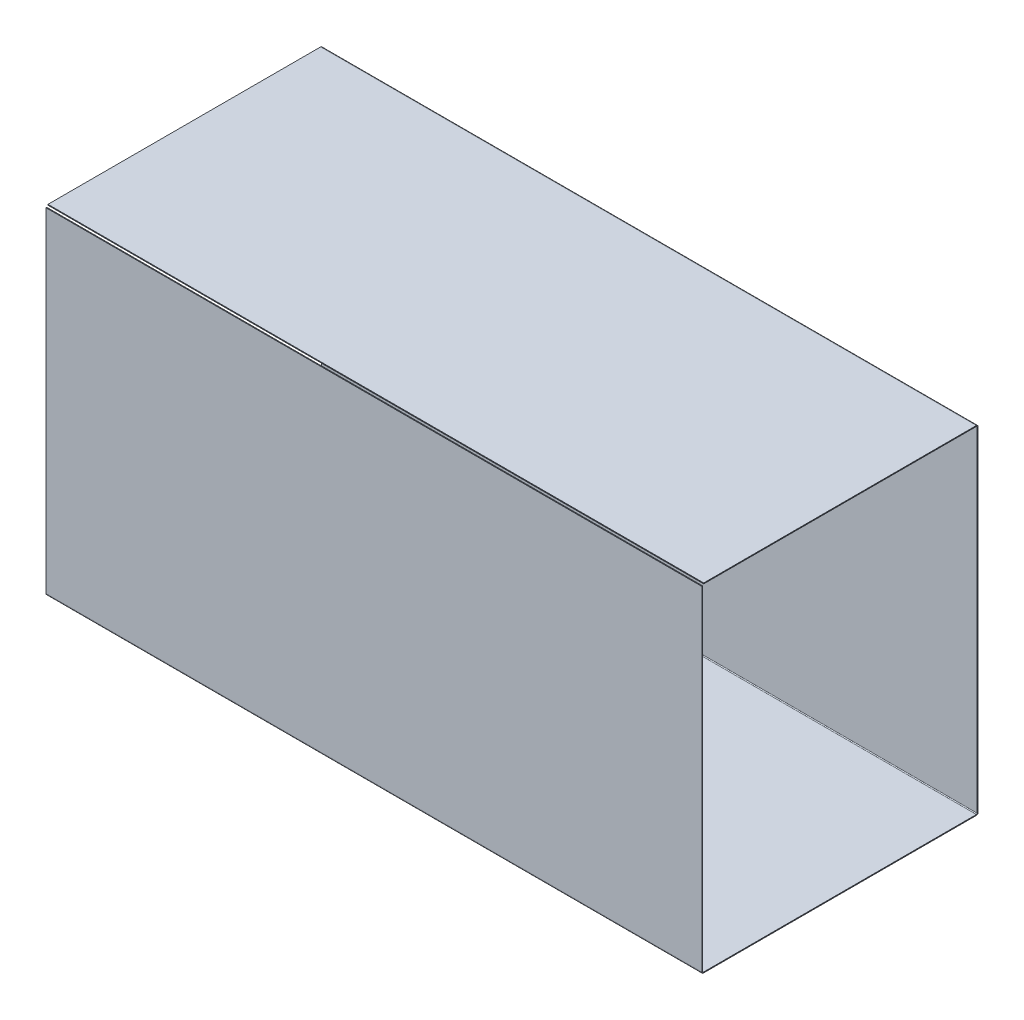
ISO-10303-21;
HEADER;
FILE_DESCRIPTION(('STEP AP214'),'2;1');
FILE_NAME('part.step','',(''),(''),'','','');
FILE_SCHEMA(('AUTOMOTIVE_DESIGN { 1 0 10303 214 1 1 1 1 }'));
ENDSEC;
DATA;
#1=APPLICATION_CONTEXT('core data for automotive mechanical design processes');
#2=APPLICATION_PROTOCOL_DEFINITION('international standard','automotive_design',2000,#1);
#3=PRODUCT_CONTEXT('',#1,'mechanical');
#4=PRODUCT('Part','Part','',(#3));
#5=PRODUCT_RELATED_PRODUCT_CATEGORY('part','',(#4));
#6=PRODUCT_DEFINITION_FORMATION('','',#4);
#7=PRODUCT_DEFINITION_CONTEXT('part definition',#1,'design');
#8=PRODUCT_DEFINITION('design','',#6,#7);
#9=PRODUCT_DEFINITION_SHAPE('','',#8);
#10=(LENGTH_UNIT() NAMED_UNIT(*) SI_UNIT(.MILLI.,.METRE.));
#11=(NAMED_UNIT(*) PLANE_ANGLE_UNIT() SI_UNIT($,.RADIAN.));
#12=(NAMED_UNIT(*) SI_UNIT($,.STERADIAN.) SOLID_ANGLE_UNIT());
#13=UNCERTAINTY_MEASURE_WITH_UNIT(LENGTH_MEASURE(1.E-05),#10,'distance_accuracy_value','');
#14=(GEOMETRIC_REPRESENTATION_CONTEXT(3) GLOBAL_UNCERTAINTY_ASSIGNED_CONTEXT((#13)) GLOBAL_UNIT_ASSIGNED_CONTEXT((#10,
#11,#12)) REPRESENTATION_CONTEXT('',''));
#15=CARTESIAN_POINT('',(0.,0.,0.));
#16=DIRECTION('',(0.,0.,1.));
#17=DIRECTION('',(1.,0.,0.));
#18=AXIS2_PLACEMENT_3D('',#15,#16,#17);
#19=CARTESIAN_POINT('',(800.,-125.,-167.5));
#20=DIRECTION('',(1.,0.,0.));
#21=DIRECTION('',(0.,1.,0.));
#22=AXIS2_PLACEMENT_3D('',#19,#20,#21);
#23=PLANE('',#22);
#24=DIRECTION('',(0.,0.,-1.));
#25=VECTOR('',#24,1.);
#26=CARTESIAN_POINT('',(800.,284.,-167.5));
#27=LINE('',#26,#25);
#28=CARTESIAN_POINT('',(800.,284.,-167.5));
#29=VERTEX_POINT('',#28);
#30=CARTESIAN_POINT('',(800.,284.,-168.5));
#31=VERTEX_POINT('',#30);
#32=EDGE_CURVE('E11',#29,#31,#27,.T.);
#33=ORIENTED_EDGE('',*,*,#32,.F.);
#34=DIRECTION('',(0.,1.,0.));
#35=VECTOR('',#34,1.);
#36=CARTESIAN_POINT('',(800.,-125.,-167.5));
#37=LINE('',#36,#35);
#38=CARTESIAN_POINT('',(800.,-124.,-167.5));
#39=VERTEX_POINT('',#38);
#40=EDGE_CURVE('E241',#39,#29,#37,.T.);
#41=ORIENTED_EDGE('',*,*,#40,.F.);
#42=DIRECTION('',(0.,0.,-1.));
#43=VECTOR('',#42,1.);
#44=CARTESIAN_POINT('',(800.,-124.,-167.5));
#45=LINE('',#44,#43);
#46=CARTESIAN_POINT('',(800.,-124.,-168.5));
#47=VERTEX_POINT('',#46);
#48=EDGE_CURVE('E47',#39,#47,#45,.T.);
#49=ORIENTED_EDGE('',*,*,#48,.T.);
#50=DIRECTION('',(0.,1.,0.));
#51=VECTOR('',#50,1.);
#52=CARTESIAN_POINT('',(800.,0.,-168.5));
#53=LINE('',#52,#51);
#54=EDGE_CURVE('E173',#47,#31,#53,.T.);
#55=ORIENTED_EDGE('',*,*,#54,.T.);
#56=EDGE_LOOP('',(#33,#41,#49,#55));
#57=FACE_BOUND('',#56,.T.);
#58=ADVANCED_FACE('F37',(#57),#23,.T.);
#59=CARTESIAN_POINT('',(800.,-124.,-166.5));
#60=DIRECTION('',(-1.,0.,0.));
#61=DIRECTION('',(0.,0.,1.));
#62=AXIS2_PLACEMENT_3D('',#59,#60,#61);
#63=PLANE('',#62);
#64=ORIENTED_EDGE('',*,*,#48,.F.);
#65=CARTESIAN_POINT('',(800.,-124.,-166.5));
#66=DIRECTION('',(1.,0.,0.));
#67=DIRECTION('',(0.,0.,-1.));
#68=AXIS2_PLACEMENT_3D('',#65,#66,#67);
#69=CIRCLE('',#68,1.);
#70=CARTESIAN_POINT('',(800.,-125.,-166.5));
#71=VERTEX_POINT('',#70);
#72=EDGE_CURVE('E286',#39,#71,#69,.F.);
#73=ORIENTED_EDGE('',*,*,#72,.T.);
#74=DIRECTION('',(0.,-1.,0.));
#75=VECTOR('',#74,1.);
#76=CARTESIAN_POINT('',(800.,-125.,-166.5));
#77=LINE('',#76,#75);
#78=CARTESIAN_POINT('',(800.,-126.,-166.5));
#79=VERTEX_POINT('',#78);
#80=EDGE_CURVE('E313',#71,#79,#77,.T.);
#81=ORIENTED_EDGE('',*,*,#80,.T.);
#82=CARTESIAN_POINT('',(800.,-124.,-166.5));
#83=DIRECTION('',(1.,0.,0.));
#84=DIRECTION('',(0.,1.,0.));
#85=AXIS2_PLACEMENT_3D('',#82,#83,#84);
#86=CIRCLE('',#85,2.);
#87=EDGE_CURVE('E217',#47,#79,#86,.F.);
#88=ORIENTED_EDGE('',*,*,#87,.F.);
#89=EDGE_LOOP('',(#64,#73,#81,#88));
#90=FACE_BOUND('',#89,.T.);
#91=ADVANCED_FACE('F316',(#90),#63,.F.);
#92=CARTESIAN_POINT('',(800.,-125.,167.5));
#93=DIRECTION('',(1.,0.,0.));
#94=DIRECTION('',(0.,0.,-1.));
#95=AXIS2_PLACEMENT_3D('',#92,#93,#94);
#96=PLANE('',#95);
#97=ORIENTED_EDGE('',*,*,#80,.F.);
#98=DIRECTION('',(0.,0.,-1.));
#99=VECTOR('',#98,1.);
#100=CARTESIAN_POINT('',(800.,-125.,167.5));
#101=LINE('',#100,#99);
#102=CARTESIAN_POINT('',(800.,-125.,166.5));
#103=VERTEX_POINT('',#102);
#104=EDGE_CURVE('E231',#103,#71,#101,.T.);
#105=ORIENTED_EDGE('',*,*,#104,.F.);
#106=DIRECTION('',(0.,-1.,0.));
#107=VECTOR('',#106,1.);
#108=CARTESIAN_POINT('',(800.,-125.,166.5));
#109=LINE('',#108,#107);
#110=CARTESIAN_POINT('',(800.,-126.,166.5));
#111=VERTEX_POINT('',#110);
#112=EDGE_CURVE('E146',#103,#111,#109,.T.);
#113=ORIENTED_EDGE('',*,*,#112,.T.);
#114=DIRECTION('',(0.,0.,1.));
#115=VECTOR('',#114,1.);
#116=CARTESIAN_POINT('',(800.,-126.,167.5));
#117=LINE('',#116,#115);
#118=EDGE_CURVE('E219',#111,#79,#117,.F.);
#119=ORIENTED_EDGE('',*,*,#118,.T.);
#120=EDGE_LOOP('',(#97,#105,#113,#119));
#121=FACE_BOUND('',#120,.T.);
#122=ADVANCED_FACE('F325',(#121),#96,.T.);
#123=CARTESIAN_POINT('',(800.,-124.,166.5));
#124=DIRECTION('',(1.,0.,0.));
#125=DIRECTION('',(0.,0.,-1.));
#126=AXIS2_PLACEMENT_3D('',#123,#124,#125);
#127=PLANE('',#126);
#128=ORIENTED_EDGE('',*,*,#112,.F.);
#129=CARTESIAN_POINT('',(800.,-124.,166.5));
#130=DIRECTION('',(-1.,0.,0.));
#131=DIRECTION('',(0.,0.,1.));
#132=AXIS2_PLACEMENT_3D('',#129,#130,#131);
#133=CIRCLE('',#132,1.);
#134=CARTESIAN_POINT('',(800.,-124.,167.5));
#135=VERTEX_POINT('',#134);
#136=EDGE_CURVE('E278',#103,#135,#133,.T.);
#137=ORIENTED_EDGE('',*,*,#136,.T.);
#138=DIRECTION('',(0.,0.,1.));
#139=VECTOR('',#138,1.);
#140=CARTESIAN_POINT('',(800.,-124.,167.5));
#141=LINE('',#140,#139);
#142=CARTESIAN_POINT('',(800.,-124.,168.5));
#143=VERTEX_POINT('',#142);
#144=EDGE_CURVE('E310',#135,#143,#141,.T.);
#145=ORIENTED_EDGE('',*,*,#144,.T.);
#146=CARTESIAN_POINT('',(800.,-124.,166.5));
#147=DIRECTION('',(-1.,0.,0.));
#148=DIRECTION('',(0.,-1.,0.));
#149=AXIS2_PLACEMENT_3D('',#146,#147,#148);
#150=CIRCLE('',#149,2.);
#151=EDGE_CURVE('E182',#111,#143,#150,.T.);
#152=ORIENTED_EDGE('',*,*,#151,.F.);
#153=EDGE_LOOP('',(#128,#137,#145,#152));
#154=FACE_BOUND('',#153,.T.);
#155=ADVANCED_FACE('F402',(#154),#127,.T.);
#156=CARTESIAN_POINT('',(800.,-125.,167.5));
#157=DIRECTION('',(1.,0.,0.));
#158=DIRECTION('',(0.,1.,0.));
#159=AXIS2_PLACEMENT_3D('',#156,#157,#158);
#160=PLANE('',#159);
#161=ORIENTED_EDGE('',*,*,#144,.F.);
#162=DIRECTION('',(0.,1.,0.));
#163=VECTOR('',#162,1.);
#164=CARTESIAN_POINT('',(800.,-125.,167.5));
#165=LINE('',#164,#163);
#166=CARTESIAN_POINT('',(800.,283.585786437627,167.5));
#167=VERTEX_POINT('',#166);
#168=EDGE_CURVE('E245',#135,#167,#165,.T.);
#169=ORIENTED_EDGE('',*,*,#168,.T.);
#170=DIRECTION('',(0.,0.,1.));
#171=VECTOR('',#170,1.);
#172=CARTESIAN_POINT('',(800.,283.585786437627,167.5));
#173=LINE('',#172,#171);
#174=CARTESIAN_POINT('',(800.,283.585786437627,168.5));
#175=VERTEX_POINT('',#174);
#176=EDGE_CURVE('E308',#167,#175,#173,.T.);
#177=ORIENTED_EDGE('',*,*,#176,.T.);
#178=DIRECTION('',(0.,1.,0.));
#179=VECTOR('',#178,1.);
#180=CARTESIAN_POINT('',(800.,0.,168.5));
#181=LINE('',#180,#179);
#182=EDGE_CURVE('E172',#143,#175,#181,.T.);
#183=ORIENTED_EDGE('',*,*,#182,.F.);
#184=EDGE_LOOP('',(#161,#169,#177,#183));
#185=FACE_BOUND('',#184,.T.);
#186=ADVANCED_FACE('F405',(#185),#160,.T.);
#187=CARTESIAN_POINT('',(0.,283.585786437627,167.5));
#188=DIRECTION('',(0.,1.,0.));
#189=DIRECTION('',(-1.,0.,0.));
#190=AXIS2_PLACEMENT_3D('',#187,#188,#189);
#191=PLANE('',#190);
#192=ORIENTED_EDGE('',*,*,#176,.F.);
#193=DIRECTION('',(-1.,0.,0.));
#194=VECTOR('',#193,1.);
#195=CARTESIAN_POINT('',(0.,283.585786437627,167.5));
#196=LINE('',#195,#194);
#197=CARTESIAN_POINT('',(0.,283.585786437627,167.5));
#198=VERTEX_POINT('',#197);
#199=EDGE_CURVE('E254',#167,#198,#196,.T.);
#200=ORIENTED_EDGE('',*,*,#199,.T.);
#201=DIRECTION('',(0.,0.,1.));
#202=VECTOR('',#201,1.);
#203=CARTESIAN_POINT('',(0.,283.585786437627,167.5));
#204=LINE('',#203,#202);
#205=CARTESIAN_POINT('',(0.,283.585786437627,168.5));
#206=VERTEX_POINT('',#205);
#207=EDGE_CURVE('E130',#198,#206,#204,.T.);
#208=ORIENTED_EDGE('',*,*,#207,.T.);
#209=DIRECTION('',(1.,0.,0.));
#210=VECTOR('',#209,1.);
#211=CARTESIAN_POINT('',(0.,283.585786437627,168.5));
#212=LINE('',#211,#210);
#213=EDGE_CURVE('E171',#175,#206,#212,.F.);
#214=ORIENTED_EDGE('',*,*,#213,.F.);
#215=EDGE_LOOP('',(#192,#200,#208,#214));
#216=FACE_BOUND('',#215,.T.);
#217=ADVANCED_FACE('F409',(#216),#191,.T.);
#218=CARTESIAN_POINT('',(0.,285.,167.5));
#219=DIRECTION('',(-1.,0.,0.));
#220=DIRECTION('',(0.,-1.,0.));
#221=AXIS2_PLACEMENT_3D('',#218,#219,#220);
#222=PLANE('',#221);
#223=ORIENTED_EDGE('',*,*,#207,.F.);
#224=DIRECTION('',(0.,-1.,0.));
#225=VECTOR('',#224,1.);
#226=CARTESIAN_POINT('',(0.,285.,167.5));
#227=LINE('',#226,#225);
#228=CARTESIAN_POINT('',(0.,-124.,167.5));
#229=VERTEX_POINT('',#228);
#230=EDGE_CURVE('E158',#198,#229,#227,.T.);
#231=ORIENTED_EDGE('',*,*,#230,.T.);
#232=DIRECTION('',(0.,0.,1.));
#233=VECTOR('',#232,1.);
#234=CARTESIAN_POINT('',(0.,-124.,167.5));
#235=LINE('',#234,#233);
#236=CARTESIAN_POINT('',(0.,-124.,168.5));
#237=VERTEX_POINT('',#236);
#238=EDGE_CURVE('E153',#229,#237,#235,.T.);
#239=ORIENTED_EDGE('',*,*,#238,.T.);
#240=DIRECTION('',(0.,1.,0.));
#241=VECTOR('',#240,1.);
#242=CARTESIAN_POINT('',(0.,0.,168.5));
#243=LINE('',#242,#241);
#244=EDGE_CURVE('E156',#206,#237,#243,.F.);
#245=ORIENTED_EDGE('',*,*,#244,.F.);
#246=EDGE_LOOP('',(#223,#231,#239,#245));
#247=FACE_BOUND('',#246,.T.);
#248=ADVANCED_FACE('F155',(#247),#222,.T.);
#249=CARTESIAN_POINT('',(0.,-124.,166.5));
#250=DIRECTION('',(1.,0.,0.));
#251=DIRECTION('',(0.,1.,0.));
#252=AXIS2_PLACEMENT_3D('',#249,#250,#251);
#253=PLANE('',#252);
#254=ORIENTED_EDGE('',*,*,#238,.F.);
#255=CARTESIAN_POINT('',(0.,-124.,166.5));
#256=DIRECTION('',(-1.,0.,0.));
#257=DIRECTION('',(0.,-1.,0.));
#258=AXIS2_PLACEMENT_3D('',#255,#256,#257);
#259=CIRCLE('',#258,1.);
#260=CARTESIAN_POINT('',(0.,-125.,166.5));
#261=VERTEX_POINT('',#260);
#262=EDGE_CURVE('E269',#229,#261,#259,.F.);
#263=ORIENTED_EDGE('',*,*,#262,.T.);
#264=DIRECTION('',(0.,-1.,0.));
#265=VECTOR('',#264,1.);
#266=CARTESIAN_POINT('',(0.,-125.,166.5));
#267=LINE('',#266,#265);
#268=CARTESIAN_POINT('',(0.,-126.,166.5));
#269=VERTEX_POINT('',#268);
#270=EDGE_CURVE('E163',#261,#269,#267,.T.);
#271=ORIENTED_EDGE('',*,*,#270,.T.);
#272=CARTESIAN_POINT('',(0.,-124.,166.5));
#273=DIRECTION('',(-1.,0.,0.));
#274=DIRECTION('',(0.,-1.,0.));
#275=AXIS2_PLACEMENT_3D('',#272,#273,#274);
#276=CIRCLE('',#275,2.);
#277=EDGE_CURVE('E176',#237,#269,#276,.F.);
#278=ORIENTED_EDGE('',*,*,#277,.F.);
#279=EDGE_LOOP('',(#254,#263,#271,#278));
#280=FACE_BOUND('',#279,.T.);
#281=ADVANCED_FACE('F177',(#280),#253,.F.);
#282=CARTESIAN_POINT('',(0.,-125.,167.5));
#283=DIRECTION('',(1.,0.,0.));
#284=DIRECTION('',(0.,0.,-1.));
#285=AXIS2_PLACEMENT_3D('',#282,#283,#284);
#286=PLANE('',#285);
#287=ORIENTED_EDGE('',*,*,#270,.F.);
#288=DIRECTION('',(0.,0.,-1.));
#289=VECTOR('',#288,1.);
#290=CARTESIAN_POINT('',(0.,-125.,167.5));
#291=LINE('',#290,#289);
#292=CARTESIAN_POINT('',(0.,-125.,-166.5));
#293=VERTEX_POINT('',#292);
#294=EDGE_CURVE('E234',#261,#293,#291,.T.);
#295=ORIENTED_EDGE('',*,*,#294,.T.);
#296=DIRECTION('',(0.,-1.,0.));
#297=VECTOR('',#296,1.);
#298=CARTESIAN_POINT('',(0.,-125.,-166.5));
#299=LINE('',#298,#297);
#300=CARTESIAN_POINT('',(0.,-126.,-166.5));
#301=VERTEX_POINT('',#300);
#302=EDGE_CURVE('E303',#293,#301,#299,.T.);
#303=ORIENTED_EDGE('',*,*,#302,.T.);
#304=DIRECTION('',(0.,0.,1.));
#305=VECTOR('',#304,1.);
#306=CARTESIAN_POINT('',(0.,-126.,167.5));
#307=LINE('',#306,#305);
#308=EDGE_CURVE('E213',#269,#301,#307,.F.);
#309=ORIENTED_EDGE('',*,*,#308,.F.);
#310=EDGE_LOOP('',(#287,#295,#303,#309));
#311=FACE_BOUND('',#310,.T.);
#312=ADVANCED_FACE('F357',(#311),#286,.F.);
#313=CARTESIAN_POINT('',(0.,-124.,-166.5));
#314=DIRECTION('',(-1.,0.,0.));
#315=DIRECTION('',(0.,-1.,0.));
#316=AXIS2_PLACEMENT_3D('',#313,#314,#315);
#317=PLANE('',#316);
#318=ORIENTED_EDGE('',*,*,#302,.F.);
#319=CARTESIAN_POINT('',(0.,-124.,-166.5));
#320=DIRECTION('',(1.,0.,0.));
#321=DIRECTION('',(0.,1.,0.));
#322=AXIS2_PLACEMENT_3D('',#319,#320,#321);
#323=CIRCLE('',#322,1.);
#324=CARTESIAN_POINT('',(0.,-124.,-167.5));
#325=VERTEX_POINT('',#324);
#326=EDGE_CURVE('E281',#293,#325,#323,.T.);
#327=ORIENTED_EDGE('',*,*,#326,.T.);
#328=DIRECTION('',(0.,0.,-1.));
#329=VECTOR('',#328,1.);
#330=CARTESIAN_POINT('',(0.,-124.,-167.5));
#331=LINE('',#330,#329);
#332=CARTESIAN_POINT('',(0.,-124.,-168.5));
#333=VERTEX_POINT('',#332);
#334=EDGE_CURVE('E117',#325,#333,#331,.T.);
#335=ORIENTED_EDGE('',*,*,#334,.T.);
#336=CARTESIAN_POINT('',(0.,-124.,-166.5));
#337=DIRECTION('',(1.,0.,0.));
#338=DIRECTION('',(0.,1.,0.));
#339=AXIS2_PLACEMENT_3D('',#336,#337,#338);
#340=CIRCLE('',#339,2.);
#341=EDGE_CURVE('E214',#301,#333,#340,.T.);
#342=ORIENTED_EDGE('',*,*,#341,.F.);
#343=EDGE_LOOP('',(#318,#327,#335,#342));
#344=FACE_BOUND('',#343,.T.);
#345=ADVANCED_FACE('F361',(#344),#317,.T.);
#346=CARTESIAN_POINT('',(0.,285.,-167.5));
#347=DIRECTION('',(-1.,0.,0.));
#348=DIRECTION('',(0.,-1.,0.));
#349=AXIS2_PLACEMENT_3D('',#346,#347,#348);
#350=PLANE('',#349);
#351=ORIENTED_EDGE('',*,*,#334,.F.);
#352=DIRECTION('',(0.,-1.,0.));
#353=VECTOR('',#352,1.);
#354=CARTESIAN_POINT('',(0.,285.,-167.5));
#355=LINE('',#354,#353);
#356=CARTESIAN_POINT('',(0.,284.,-167.5));
#357=VERTEX_POINT('',#356);
#358=EDGE_CURVE('E238',#357,#325,#355,.T.);
#359=ORIENTED_EDGE('',*,*,#358,.F.);
#360=DIRECTION('',(0.,0.,-1.));
#361=VECTOR('',#360,1.);
#362=CARTESIAN_POINT('',(0.,284.,-167.5));
#363=LINE('',#362,#361);
#364=CARTESIAN_POINT('',(0.,284.,-168.5));
#365=VERTEX_POINT('',#364);
#366=EDGE_CURVE('E299',#357,#365,#363,.T.);
#367=ORIENTED_EDGE('',*,*,#366,.T.);
#368=DIRECTION('',(0.,1.,0.));
#369=VECTOR('',#368,1.);
#370=CARTESIAN_POINT('',(0.,0.,-168.5));
#371=LINE('',#370,#369);
#372=EDGE_CURVE('E211',#365,#333,#371,.F.);
#373=ORIENTED_EDGE('',*,*,#372,.T.);
#374=EDGE_LOOP('',(#351,#359,#367,#373));
#375=FACE_BOUND('',#374,.T.);
#376=ADVANCED_FACE('F372',(#375),#350,.T.);
#377=CARTESIAN_POINT('',(0.,284.,-166.5));
#378=DIRECTION('',(1.,0.,0.));
#379=DIRECTION('',(0.,1.,0.));
#380=AXIS2_PLACEMENT_3D('',#377,#378,#379);
#381=PLANE('',#380);
#382=ORIENTED_EDGE('',*,*,#366,.F.);
#383=CARTESIAN_POINT('',(0.,284.,-166.5));
#384=DIRECTION('',(-1.,0.,0.));
#385=DIRECTION('',(0.,-1.,0.));
#386=AXIS2_PLACEMENT_3D('',#383,#384,#385);
#387=CIRCLE('',#386,1.);
#388=CARTESIAN_POINT('',(0.,285.,-166.5));
#389=VERTEX_POINT('',#388);
#390=EDGE_CURVE('E266',#357,#389,#387,.F.);
#391=ORIENTED_EDGE('',*,*,#390,.T.);
#392=DIRECTION('',(0.,1.,0.));
#393=VECTOR('',#392,1.);
#394=CARTESIAN_POINT('',(0.,285.,-166.5));
#395=LINE('',#394,#393);
#396=CARTESIAN_POINT('',(0.,286.,-166.5));
#397=VERTEX_POINT('',#396);
#398=EDGE_CURVE('E296',#389,#397,#395,.T.);
#399=ORIENTED_EDGE('',*,*,#398,.T.);
#400=CARTESIAN_POINT('',(0.,284.,-166.5));
#401=DIRECTION('',(-1.,0.,0.));
#402=DIRECTION('',(0.,-1.,0.));
#403=AXIS2_PLACEMENT_3D('',#400,#401,#402);
#404=CIRCLE('',#403,2.);
#405=EDGE_CURVE('E181',#365,#397,#404,.F.);
#406=ORIENTED_EDGE('',*,*,#405,.F.);
#407=EDGE_LOOP('',(#382,#391,#399,#406));
#408=FACE_BOUND('',#407,.T.);
#409=ADVANCED_FACE('F385',(#408),#381,.F.);
#410=CARTESIAN_POINT('',(0.,285.,167.5));
#411=DIRECTION('',(-1.,0.,0.));
#412=DIRECTION('',(0.,0.,-1.));
#413=AXIS2_PLACEMENT_3D('',#410,#411,#412);
#414=PLANE('',#413);
#415=ORIENTED_EDGE('',*,*,#398,.F.);
#416=DIRECTION('',(0.,0.,-1.));
#417=VECTOR('',#416,1.);
#418=CARTESIAN_POINT('',(0.,285.,167.5));
#419=LINE('',#418,#417);
#420=CARTESIAN_POINT('',(0.,285.,166.085786437627));
#421=VERTEX_POINT('',#420);
#422=EDGE_CURVE('E248',#421,#389,#419,.T.);
#423=ORIENTED_EDGE('',*,*,#422,.F.);
#424=DIRECTION('',(0.,1.,0.));
#425=VECTOR('',#424,1.);
#426=CARTESIAN_POINT('',(0.,285.,166.085786437627));
#427=LINE('',#426,#425);
#428=CARTESIAN_POINT('',(0.,286.,166.085786437627));
#429=VERTEX_POINT('',#428);
#430=EDGE_CURVE('E293',#421,#429,#427,.T.);
#431=ORIENTED_EDGE('',*,*,#430,.T.);
#432=DIRECTION('',(0.,0.,1.));
#433=VECTOR('',#432,1.);
#434=CARTESIAN_POINT('',(0.,286.,167.5));
#435=LINE('',#434,#433);
#436=EDGE_CURVE('E202',#429,#397,#435,.F.);
#437=ORIENTED_EDGE('',*,*,#436,.T.);
#438=EDGE_LOOP('',(#415,#423,#431,#437));
#439=FACE_BOUND('',#438,.T.);
#440=ADVANCED_FACE('F347',(#439),#414,.T.);
#441=CARTESIAN_POINT('',(800.,285.,166.085786437627));
#442=DIRECTION('',(0.,0.,-1.));
#443=DIRECTION('',(1.,0.,0.));
#444=AXIS2_PLACEMENT_3D('',#441,#442,#443);
#445=PLANE('',#444);
#446=ORIENTED_EDGE('',*,*,#430,.F.);
#447=DIRECTION('',(1.,0.,0.));
#448=VECTOR('',#447,1.);
#449=CARTESIAN_POINT('',(800.,285.,166.085786437627));
#450=LINE('',#449,#448);
#451=CARTESIAN_POINT('',(800.,285.,166.085786437627));
#452=VERTEX_POINT('',#451);
#453=EDGE_CURVE('E256',#421,#452,#450,.T.);
#454=ORIENTED_EDGE('',*,*,#453,.T.);
#455=DIRECTION('',(0.,1.,0.));
#456=VECTOR('',#455,1.);
#457=CARTESIAN_POINT('',(800.,285.,166.085786437627));
#458=LINE('',#457,#456);
#459=CARTESIAN_POINT('',(800.,286.,166.085786437627));
#460=VERTEX_POINT('',#459);
#461=EDGE_CURVE('E290',#452,#460,#458,.T.);
#462=ORIENTED_EDGE('',*,*,#461,.T.);
#463=DIRECTION('',(1.,0.,0.));
#464=VECTOR('',#463,1.);
#465=CARTESIAN_POINT('',(800.,286.,166.085786437627));
#466=LINE('',#465,#464);
#467=EDGE_CURVE('E203',#429,#460,#466,.T.);
#468=ORIENTED_EDGE('',*,*,#467,.F.);
#469=EDGE_LOOP('',(#446,#454,#462,#468));
#470=FACE_BOUND('',#469,.T.);
#471=ADVANCED_FACE('F352',(#470),#445,.F.);
#472=CARTESIAN_POINT('',(800.,285.,167.5));
#473=DIRECTION('',(-1.,0.,0.));
#474=DIRECTION('',(0.,0.,-1.));
#475=AXIS2_PLACEMENT_3D('',#472,#473,#474);
#476=PLANE('',#475);
#477=ORIENTED_EDGE('',*,*,#461,.F.);
#478=DIRECTION('',(0.,0.,-1.));
#479=VECTOR('',#478,1.);
#480=CARTESIAN_POINT('',(800.,285.,167.5));
#481=LINE('',#480,#479);
#482=CARTESIAN_POINT('',(800.,285.,-166.5));
#483=VERTEX_POINT('',#482);
#484=EDGE_CURVE('E251',#452,#483,#481,.T.);
#485=ORIENTED_EDGE('',*,*,#484,.T.);
#486=DIRECTION('',(0.,1.,0.));
#487=VECTOR('',#486,1.);
#488=CARTESIAN_POINT('',(800.,285.,-166.5));
#489=LINE('',#488,#487);
#490=CARTESIAN_POINT('',(800.,286.,-166.5));
#491=VERTEX_POINT('',#490);
#492=EDGE_CURVE('E41',#483,#491,#489,.T.);
#493=ORIENTED_EDGE('',*,*,#492,.T.);
#494=DIRECTION('',(0.,0.,1.));
#495=VECTOR('',#494,1.);
#496=CARTESIAN_POINT('',(800.,286.,167.5));
#497=LINE('',#496,#495);
#498=EDGE_CURVE('E199',#460,#491,#497,.F.);
#499=ORIENTED_EDGE('',*,*,#498,.F.);
#500=EDGE_LOOP('',(#477,#485,#493,#499));
#501=FACE_BOUND('',#500,.T.);
#502=ADVANCED_FACE('F451',(#501),#476,.F.);
#503=CARTESIAN_POINT('',(800.,284.,-166.5));
#504=DIRECTION('',(1.,0.,0.));
#505=DIRECTION('',(0.,0.,-1.));
#506=AXIS2_PLACEMENT_3D('',#503,#504,#505);
#507=PLANE('',#506);
#508=CARTESIAN_POINT('',(800.,284.,-166.5));
#509=DIRECTION('',(-1.,0.,0.));
#510=DIRECTION('',(0.,0.,1.));
#511=AXIS2_PLACEMENT_3D('',#508,#509,#510);
#512=CIRCLE('',#511,1.);
#513=EDGE_CURVE('E235',#483,#29,#512,.T.);
#514=ORIENTED_EDGE('',*,*,#513,.T.);
#515=ORIENTED_EDGE('',*,*,#32,.T.);
#516=CARTESIAN_POINT('',(800.,284.,-166.5));
#517=DIRECTION('',(-1.,0.,0.));
#518=DIRECTION('',(0.,-1.,0.));
#519=AXIS2_PLACEMENT_3D('',#516,#517,#518);
#520=CIRCLE('',#519,2.);
#521=EDGE_CURVE('E210',#491,#31,#520,.T.);
#522=ORIENTED_EDGE('',*,*,#521,.F.);
#523=ORIENTED_EDGE('',*,*,#492,.F.);
#524=EDGE_LOOP('',(#514,#515,#522,#523));
#525=FACE_BOUND('',#524,.T.);
#526=ADVANCED_FACE('F39',(#525),#507,.T.);
#527=CARTESIAN_POINT('',(800.,286.,167.5));
#528=DIRECTION('',(0.,-1.,0.));
#529=DIRECTION('',(1.,0.,0.));
#530=AXIS2_PLACEMENT_3D('',#527,#528,#529);
#531=PLANE('',#530);
#532=ORIENTED_EDGE('',*,*,#498,.T.);
#533=DIRECTION('',(1.,0.,0.));
#534=VECTOR('',#533,1.);
#535=CARTESIAN_POINT('',(800.,286.,-166.5));
#536=LINE('',#535,#534);
#537=EDGE_CURVE('E195',#491,#397,#536,.F.);
#538=ORIENTED_EDGE('',*,*,#537,.T.);
#539=ORIENTED_EDGE('',*,*,#436,.F.);
#540=ORIENTED_EDGE('',*,*,#467,.T.);
#541=EDGE_LOOP('',(#532,#538,#539,#540));
#542=FACE_BOUND('',#541,.T.);
#543=ADVANCED_FACE('F335',(#542),#531,.F.);
#544=CARTESIAN_POINT('',(0.,0.,168.5));
#545=DIRECTION('',(0.,0.,1.));
#546=DIRECTION('',(1.,0.,0.));
#547=AXIS2_PLACEMENT_3D('',#544,#545,#546);
#548=PLANE('',#547);
#549=ORIENTED_EDGE('',*,*,#244,.T.);
#550=DIRECTION('',(1.,0.,0.));
#551=VECTOR('',#550,1.);
#552=CARTESIAN_POINT('',(0.,-124.,168.5));
#553=LINE('',#552,#551);
#554=EDGE_CURVE('E170',#237,#143,#553,.T.);
#555=ORIENTED_EDGE('',*,*,#554,.T.);
#556=ORIENTED_EDGE('',*,*,#182,.T.);
#557=ORIENTED_EDGE('',*,*,#213,.T.);
#558=EDGE_LOOP('',(#549,#555,#556,#557));
#559=FACE_BOUND('',#558,.T.);
#560=ADVANCED_FACE('F167',(#559),#548,.T.);
#561=CARTESIAN_POINT('',(0.,0.,-168.5));
#562=DIRECTION('',(0.,0.,1.));
#563=DIRECTION('',(1.,0.,0.));
#564=AXIS2_PLACEMENT_3D('',#561,#562,#563);
#565=PLANE('',#564);
#566=ORIENTED_EDGE('',*,*,#54,.F.);
#567=DIRECTION('',(1.,0.,0.));
#568=VECTOR('',#567,1.);
#569=CARTESIAN_POINT('',(0.,-124.,-168.5));
#570=LINE('',#569,#568);
#571=EDGE_CURVE('E324',#47,#333,#570,.F.);
#572=ORIENTED_EDGE('',*,*,#571,.T.);
#573=ORIENTED_EDGE('',*,*,#372,.F.);
#574=DIRECTION('',(1.,0.,0.));
#575=VECTOR('',#574,1.);
#576=CARTESIAN_POINT('',(0.,284.,-168.5));
#577=LINE('',#576,#575);
#578=EDGE_CURVE('E189',#365,#31,#577,.T.);
#579=ORIENTED_EDGE('',*,*,#578,.T.);
#580=EDGE_LOOP('',(#566,#572,#573,#579));
#581=FACE_BOUND('',#580,.T.);
#582=ADVANCED_FACE('F375',(#581),#565,.F.);
#583=CARTESIAN_POINT('',(0.,-126.,167.5));
#584=DIRECTION('',(0.,1.,0.));
#585=DIRECTION('',(-1.,0.,0.));
#586=AXIS2_PLACEMENT_3D('',#583,#584,#585);
#587=PLANE('',#586);
#588=ORIENTED_EDGE('',*,*,#308,.T.);
#589=DIRECTION('',(-1.,0.,0.));
#590=VECTOR('',#589,1.);
#591=CARTESIAN_POINT('',(0.,-126.,-166.5));
#592=LINE('',#591,#590);
#593=EDGE_CURVE('E192',#301,#79,#592,.F.);
#594=ORIENTED_EDGE('',*,*,#593,.T.);
#595=ORIENTED_EDGE('',*,*,#118,.F.);
#596=DIRECTION('',(-1.,0.,0.));
#597=VECTOR('',#596,1.);
#598=CARTESIAN_POINT('',(0.,-126.,166.5));
#599=LINE('',#598,#597);
#600=EDGE_CURVE('E188',#111,#269,#599,.T.);
#601=ORIENTED_EDGE('',*,*,#600,.T.);
#602=EDGE_LOOP('',(#588,#594,#595,#601));
#603=FACE_BOUND('',#602,.T.);
#604=ADVANCED_FACE('F327',(#603),#587,.F.);
#605=CARTESIAN_POINT('',(800.,284.,-166.5));
#606=DIRECTION('',(-1.,0.,0.));
#607=DIRECTION('',(0.,-1.,0.));
#608=AXIS2_PLACEMENT_3D('',#605,#606,#607);
#609=CYLINDRICAL_SURFACE('',#608,2.);
#610=ORIENTED_EDGE('',*,*,#521,.T.);
#611=ORIENTED_EDGE('',*,*,#578,.F.);
#612=ORIENTED_EDGE('',*,*,#405,.T.);
#613=ORIENTED_EDGE('',*,*,#537,.F.);
#614=EDGE_LOOP('',(#610,#611,#612,#613));
#615=FACE_BOUND('',#614,.T.);
#616=ADVANCED_FACE('F342',(#615),#609,.T.);
#617=CARTESIAN_POINT('',(0.,-124.,166.5));
#618=DIRECTION('',(-1.,0.,0.));
#619=DIRECTION('',(0.,-1.,0.));
#620=AXIS2_PLACEMENT_3D('',#617,#618,#619);
#621=CYLINDRICAL_SURFACE('',#620,2.);
#622=ORIENTED_EDGE('',*,*,#277,.T.);
#623=ORIENTED_EDGE('',*,*,#600,.F.);
#624=ORIENTED_EDGE('',*,*,#151,.T.);
#625=ORIENTED_EDGE('',*,*,#554,.F.);
#626=EDGE_LOOP('',(#622,#623,#624,#625));
#627=FACE_BOUND('',#626,.T.);
#628=ADVANCED_FACE('F185',(#627),#621,.T.);
#629=CARTESIAN_POINT('',(0.,-124.,-166.5));
#630=DIRECTION('',(1.,0.,0.));
#631=DIRECTION('',(0.,1.,0.));
#632=AXIS2_PLACEMENT_3D('',#629,#630,#631);
#633=CYLINDRICAL_SURFACE('',#632,2.);
#634=ORIENTED_EDGE('',*,*,#341,.T.);
#635=ORIENTED_EDGE('',*,*,#571,.F.);
#636=ORIENTED_EDGE('',*,*,#87,.T.);
#637=ORIENTED_EDGE('',*,*,#593,.F.);
#638=EDGE_LOOP('',(#634,#635,#636,#637));
#639=FACE_BOUND('',#638,.T.);
#640=ADVANCED_FACE('F321',(#639),#633,.T.);
#641=CARTESIAN_POINT('',(800.,285.,167.5));
#642=DIRECTION('',(0.,-1.,0.));
#643=DIRECTION('',(1.,0.,0.));
#644=AXIS2_PLACEMENT_3D('',#641,#642,#643);
#645=PLANE('',#644);
#646=ORIENTED_EDGE('',*,*,#484,.F.);
#647=ORIENTED_EDGE('',*,*,#453,.F.);
#648=ORIENTED_EDGE('',*,*,#422,.T.);
#649=DIRECTION('',(-1.,0.,0.));
#650=VECTOR('',#649,1.);
#651=CARTESIAN_POINT('',(800.,285.,-166.5));
#652=LINE('',#651,#650);
#653=EDGE_CURVE('E259',#483,#389,#652,.T.);
#654=ORIENTED_EDGE('',*,*,#653,.F.);
#655=EDGE_LOOP('',(#646,#647,#648,#654));
#656=FACE_BOUND('',#655,.T.);
#657=ADVANCED_FACE('F384',(#656),#645,.T.);
#658=CARTESIAN_POINT('',(0.,0.,167.5));
#659=DIRECTION('',(0.,0.,1.));
#660=DIRECTION('',(1.,0.,0.));
#661=AXIS2_PLACEMENT_3D('',#658,#659,#660);
#662=PLANE('',#661);
#663=ORIENTED_EDGE('',*,*,#230,.F.);
#664=ORIENTED_EDGE('',*,*,#199,.F.);
#665=ORIENTED_EDGE('',*,*,#168,.F.);
#666=DIRECTION('',(1.,0.,0.));
#667=VECTOR('',#666,1.);
#668=CARTESIAN_POINT('',(800.,-124.,167.5));
#669=LINE('',#668,#667);
#670=EDGE_CURVE('E265',#229,#135,#669,.T.);
#671=ORIENTED_EDGE('',*,*,#670,.F.);
#672=EDGE_LOOP('',(#663,#664,#665,#671));
#673=FACE_BOUND('',#672,.T.);
#674=ADVANCED_FACE('F541',(#673),#662,.F.);
#675=CARTESIAN_POINT('',(0.,0.,-167.5));
#676=DIRECTION('',(0.,0.,1.));
#677=DIRECTION('',(1.,0.,0.));
#678=AXIS2_PLACEMENT_3D('',#675,#676,#677);
#679=PLANE('',#678);
#680=ORIENTED_EDGE('',*,*,#40,.T.);
#681=DIRECTION('',(-1.,0.,0.));
#682=VECTOR('',#681,1.);
#683=CARTESIAN_POINT('',(0.,284.,-167.5));
#684=LINE('',#683,#682);
#685=EDGE_CURVE('E262',#357,#29,#684,.F.);
#686=ORIENTED_EDGE('',*,*,#685,.F.);
#687=ORIENTED_EDGE('',*,*,#358,.T.);
#688=DIRECTION('',(1.,0.,0.));
#689=VECTOR('',#688,1.);
#690=CARTESIAN_POINT('',(0.,-124.,-167.5));
#691=LINE('',#690,#689);
#692=EDGE_CURVE('E227',#39,#325,#691,.F.);
#693=ORIENTED_EDGE('',*,*,#692,.F.);
#694=EDGE_LOOP('',(#680,#686,#687,#693));
#695=FACE_BOUND('',#694,.T.);
#696=ADVANCED_FACE('F370',(#695),#679,.T.);
#697=CARTESIAN_POINT('',(0.,-125.,167.5));
#698=DIRECTION('',(0.,1.,0.));
#699=DIRECTION('',(-1.,0.,0.));
#700=AXIS2_PLACEMENT_3D('',#697,#698,#699);
#701=PLANE('',#700);
#702=ORIENTED_EDGE('',*,*,#294,.F.);
#703=DIRECTION('',(1.,0.,0.));
#704=VECTOR('',#703,1.);
#705=CARTESIAN_POINT('',(0.,-125.,166.5));
#706=LINE('',#705,#704);
#707=EDGE_CURVE('E274',#103,#261,#706,.F.);
#708=ORIENTED_EDGE('',*,*,#707,.F.);
#709=ORIENTED_EDGE('',*,*,#104,.T.);
#710=DIRECTION('',(1.,0.,0.));
#711=VECTOR('',#710,1.);
#712=CARTESIAN_POINT('',(0.,-125.,-166.5));
#713=LINE('',#712,#711);
#714=EDGE_CURVE('E277',#293,#71,#713,.T.);
#715=ORIENTED_EDGE('',*,*,#714,.F.);
#716=EDGE_LOOP('',(#702,#708,#709,#715));
#717=FACE_BOUND('',#716,.T.);
#718=ADVANCED_FACE('F364',(#717),#701,.T.);
#719=CARTESIAN_POINT('',(800.,284.,-166.5));
#720=DIRECTION('',(-1.,0.,0.));
#721=DIRECTION('',(0.,-1.,0.));
#722=AXIS2_PLACEMENT_3D('',#719,#720,#721);
#723=CYLINDRICAL_SURFACE('',#722,1.);
#724=ORIENTED_EDGE('',*,*,#513,.F.);
#725=ORIENTED_EDGE('',*,*,#653,.T.);
#726=ORIENTED_EDGE('',*,*,#390,.F.);
#727=ORIENTED_EDGE('',*,*,#685,.T.);
#728=EDGE_LOOP('',(#724,#725,#726,#727));
#729=FACE_BOUND('',#728,.T.);
#730=ADVANCED_FACE('F379',(#729),#723,.F.);
#731=CARTESIAN_POINT('',(0.,-124.,166.5));
#732=DIRECTION('',(-1.,0.,0.));
#733=DIRECTION('',(0.,-1.,0.));
#734=AXIS2_PLACEMENT_3D('',#731,#732,#733);
#735=CYLINDRICAL_SURFACE('',#734,1.);
#736=ORIENTED_EDGE('',*,*,#262,.F.);
#737=ORIENTED_EDGE('',*,*,#670,.T.);
#738=ORIENTED_EDGE('',*,*,#136,.F.);
#739=ORIENTED_EDGE('',*,*,#707,.T.);
#740=EDGE_LOOP('',(#736,#737,#738,#739));
#741=FACE_BOUND('',#740,.T.);
#742=ADVANCED_FACE('F579',(#741),#735,.F.);
#743=CARTESIAN_POINT('',(0.,-124.,-166.5));
#744=DIRECTION('',(1.,0.,0.));
#745=DIRECTION('',(0.,1.,0.));
#746=AXIS2_PLACEMENT_3D('',#743,#744,#745);
#747=CYLINDRICAL_SURFACE('',#746,1.);
#748=ORIENTED_EDGE('',*,*,#326,.F.);
#749=ORIENTED_EDGE('',*,*,#714,.T.);
#750=ORIENTED_EDGE('',*,*,#72,.F.);
#751=ORIENTED_EDGE('',*,*,#692,.T.);
#752=EDGE_LOOP('',(#748,#749,#750,#751));
#753=FACE_BOUND('',#752,.T.);
#754=ADVANCED_FACE('F367',(#753),#747,.F.);
#755=CLOSED_SHELL('',(#58,#91,#122,#155,#186,#217,#248,#281,#312,#345,#376,#409,#440,#471,#502,
#526,#543,#560,#582,#604,#616,#628,#640,#657,#674,#696,#718,#730,#742,#754));
#756=MANIFOLD_SOLID_BREP('B2',#755);
#757=ADVANCED_BREP_SHAPE_REPRESENTATION('',(#18,#756),#14);
#758=SHAPE_DEFINITION_REPRESENTATION(#9,#757);
ENDSEC;
END-ISO-10303-21;
